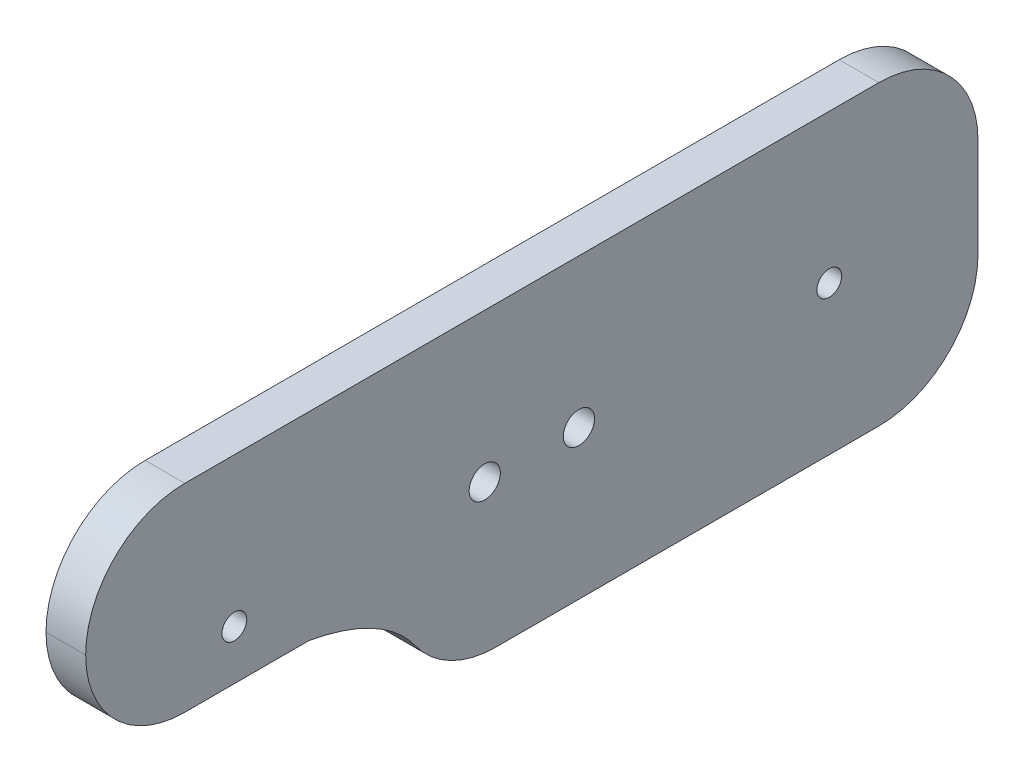
ISO-10303-21;
HEADER;
FILE_DESCRIPTION(('STEP AP214'),'2;1');
FILE_NAME('part.step','',(''),(''),'','','');
FILE_SCHEMA(('AUTOMOTIVE_DESIGN { 1 0 10303 214 1 1 1 1 }'));
ENDSEC;
DATA;
#1=APPLICATION_CONTEXT('core data for automotive mechanical design processes');
#2=APPLICATION_PROTOCOL_DEFINITION('international standard','automotive_design',2000,#1);
#3=PRODUCT_CONTEXT('',#1,'mechanical');
#4=PRODUCT('Part','Part','',(#3));
#5=PRODUCT_RELATED_PRODUCT_CATEGORY('part','',(#4));
#6=PRODUCT_DEFINITION_FORMATION('','',#4);
#7=PRODUCT_DEFINITION_CONTEXT('part definition',#1,'design');
#8=PRODUCT_DEFINITION('design','',#6,#7);
#9=PRODUCT_DEFINITION_SHAPE('','',#8);
#10=(LENGTH_UNIT() NAMED_UNIT(*) SI_UNIT(.MILLI.,.METRE.));
#11=(NAMED_UNIT(*) PLANE_ANGLE_UNIT() SI_UNIT($,.RADIAN.));
#12=(NAMED_UNIT(*) SI_UNIT($,.STERADIAN.) SOLID_ANGLE_UNIT());
#13=UNCERTAINTY_MEASURE_WITH_UNIT(LENGTH_MEASURE(1.E-05),#10,'distance_accuracy_value','');
#14=(GEOMETRIC_REPRESENTATION_CONTEXT(3) GLOBAL_UNCERTAINTY_ASSIGNED_CONTEXT((#13)) GLOBAL_UNIT_ASSIGNED_CONTEXT((#10,
#11,#12)) REPRESENTATION_CONTEXT('',''));
#15=CARTESIAN_POINT('',(0.,0.,0.));
#16=DIRECTION('',(0.,0.,1.));
#17=DIRECTION('',(1.,0.,0.));
#18=AXIS2_PLACEMENT_3D('',#15,#16,#17);
#19=CARTESIAN_POINT('',(4.,-15.,-45.));
#20=DIRECTION('',(0.,0.,1.));
#21=DIRECTION('',(1.,0.,0.));
#22=AXIS2_PLACEMENT_3D('',#19,#20,#21);
#23=PLANE('',#22);
#24=DIRECTION('',(0.,1.,0.));
#25=VECTOR('',#24,1.);
#26=CARTESIAN_POINT('',(4.,-15.,-45.));
#27=LINE('',#26,#25);
#28=CARTESIAN_POINT('',(4.,-5.,-45.));
#29=VERTEX_POINT('',#28);
#30=CARTESIAN_POINT('',(4.,5.,-45.));
#31=VERTEX_POINT('',#30);
#32=EDGE_CURVE('E125',#29,#31,#27,.T.);
#33=ORIENTED_EDGE('',*,*,#32,.F.);
#34=DIRECTION('',(-1.,0.,0.));
#35=VECTOR('',#34,1.);
#36=CARTESIAN_POINT('',(4.,-5.,-45.));
#37=LINE('',#36,#35);
#38=CARTESIAN_POINT('',(0.,-5.,-45.));
#39=VERTEX_POINT('',#38);
#40=EDGE_CURVE('E112',#29,#39,#37,.T.);
#41=ORIENTED_EDGE('',*,*,#40,.T.);
#42=DIRECTION('',(0.,1.,0.));
#43=VECTOR('',#42,1.);
#44=CARTESIAN_POINT('',(0.,-15.,-45.));
#45=LINE('',#44,#43);
#46=CARTESIAN_POINT('',(0.,5.,-45.));
#47=VERTEX_POINT('',#46);
#48=EDGE_CURVE('E122',#39,#47,#45,.T.);
#49=ORIENTED_EDGE('',*,*,#48,.T.);
#50=DIRECTION('',(-1.,0.,0.));
#51=VECTOR('',#50,1.);
#52=CARTESIAN_POINT('',(4.,5.,-45.));
#53=LINE('',#52,#51);
#54=EDGE_CURVE('E127',#47,#31,#53,.F.);
#55=ORIENTED_EDGE('',*,*,#54,.T.);
#56=EDGE_LOOP('',(#33,#41,#49,#55));
#57=FACE_BOUND('',#56,.T.);
#58=ADVANCED_FACE('F32',(#57),#23,.F.);
#59=CARTESIAN_POINT('',(4.,15.,45.));
#60=DIRECTION('',(0.,-1.,0.));
#61=DIRECTION('',(0.,0.,-1.));
#62=AXIS2_PLACEMENT_3D('',#59,#60,#61);
#63=PLANE('',#62);
#64=DIRECTION('',(0.,0.,1.));
#65=VECTOR('',#64,1.);
#66=CARTESIAN_POINT('',(4.,15.,45.));
#67=LINE('',#66,#65);
#68=CARTESIAN_POINT('',(4.,15.,-35.));
#69=VERTEX_POINT('',#68);
#70=CARTESIAN_POINT('',(4.,15.,35.));
#71=VERTEX_POINT('',#70);
#72=EDGE_CURVE('E227',#69,#71,#67,.T.);
#73=ORIENTED_EDGE('',*,*,#72,.F.);
#74=DIRECTION('',(-1.,0.,0.));
#75=VECTOR('',#74,1.);
#76=CARTESIAN_POINT('',(4.,15.,-35.));
#77=LINE('',#76,#75);
#78=CARTESIAN_POINT('',(0.,15.,-35.));
#79=VERTEX_POINT('',#78);
#80=EDGE_CURVE('E159',#69,#79,#77,.T.);
#81=ORIENTED_EDGE('',*,*,#80,.T.);
#82=DIRECTION('',(0.,0.,1.));
#83=VECTOR('',#82,1.);
#84=CARTESIAN_POINT('',(0.,15.,45.));
#85=LINE('',#84,#83);
#86=CARTESIAN_POINT('',(0.,15.,35.));
#87=VERTEX_POINT('',#86);
#88=EDGE_CURVE('E132',#79,#87,#85,.T.);
#89=ORIENTED_EDGE('',*,*,#88,.T.);
#90=DIRECTION('',(-1.,0.,0.));
#91=VECTOR('',#90,1.);
#92=CARTESIAN_POINT('',(4.,15.,35.));
#93=LINE('',#92,#91);
#94=EDGE_CURVE('E157',#87,#71,#93,.F.);
#95=ORIENTED_EDGE('',*,*,#94,.T.);
#96=EDGE_LOOP('',(#73,#81,#89,#95));
#97=FACE_BOUND('',#96,.T.);
#98=ADVANCED_FACE('F239',(#97),#63,.F.);
#99=CARTESIAN_POINT('',(4.,-15.,45.));
#100=DIRECTION('',(0.,1.,0.));
#101=DIRECTION('',(0.,0.,1.));
#102=AXIS2_PLACEMENT_3D('',#99,#100,#101);
#103=PLANE('',#102);
#104=DIRECTION('',(0.,0.,-1.));
#105=VECTOR('',#104,1.);
#106=CARTESIAN_POINT('',(4.,-15.,45.));
#107=LINE('',#106,#105);
#108=CARTESIAN_POINT('',(4.,-15.,3.61306446035863));
#109=VERTEX_POINT('',#108);
#110=CARTESIAN_POINT('',(4.,-15.,-35.));
#111=VERTEX_POINT('',#110);
#112=EDGE_CURVE('E142',#109,#111,#107,.T.);
#113=ORIENTED_EDGE('',*,*,#112,.F.);
#114=DIRECTION('',(-1.,0.,0.));
#115=VECTOR('',#114,1.);
#116=CARTESIAN_POINT('',(0.,-15.,3.61306446035861));
#117=LINE('',#116,#115);
#118=CARTESIAN_POINT('',(0.,-15.,3.61306446035863));
#119=VERTEX_POINT('',#118);
#120=EDGE_CURVE('E40',#109,#119,#117,.T.);
#121=ORIENTED_EDGE('',*,*,#120,.T.);
#122=DIRECTION('',(0.,0.,-1.));
#123=VECTOR('',#122,1.);
#124=CARTESIAN_POINT('',(0.,-15.,45.));
#125=LINE('',#124,#123);
#126=CARTESIAN_POINT('',(0.,-15.,-35.));
#127=VERTEX_POINT('',#126);
#128=EDGE_CURVE('E136',#119,#127,#125,.T.);
#129=ORIENTED_EDGE('',*,*,#128,.T.);
#130=DIRECTION('',(-1.,0.,0.));
#131=VECTOR('',#130,1.);
#132=CARTESIAN_POINT('',(4.,-15.,-35.));
#133=LINE('',#132,#131);
#134=EDGE_CURVE('E114',#127,#111,#133,.F.);
#135=ORIENTED_EDGE('',*,*,#134,.T.);
#136=EDGE_LOOP('',(#113,#121,#129,#135));
#137=FACE_BOUND('',#136,.T.);
#138=ADVANCED_FACE('F231',(#137),#103,.F.);
#139=CARTESIAN_POINT('',(4.,0.,0.));
#140=DIRECTION('',(-1.,0.,0.));
#141=DIRECTION('',(0.,0.,1.));
#142=AXIS2_PLACEMENT_3D('',#139,#140,#141);
#143=PLANE('',#142);
#144=CARTESIAN_POINT('',(4.,-5.,22.5));
#145=CARTESIAN_POINT('',(4.,-6.22849461948267,15.5328607990294));
#146=CARTESIAN_POINT('',(4.,-9.74512800622977,10.9265757126709));
#147=CARTESIAN_POINT('',(4.,-15.,9.99999999999998));
#148=B_SPLINE_CURVE_WITH_KNOTS('',3,(#144,#145,#146,#147),.UNSPECIFIED.,.F.,.F.,(4,4),(0.,1.),.UNSPECIFIED.);
#149=CARTESIAN_POINT('',(4.,-5.,22.5));
#150=VERTEX_POINT('',#149);
#151=CARTESIAN_POINT('',(4.,-10.812230751289,11.7505071602349));
#152=VERTEX_POINT('',#151);
#153=EDGE_CURVE('E182',#150,#152,#148,.T.);
#154=ORIENTED_EDGE('',*,*,#153,.T.);
#155=CARTESIAN_POINT('',(4.,-5.00000000000001,3.61306446035861));
#156=DIRECTION('',(-1.,0.,0.));
#157=DIRECTION('',(0.,0.,1.));
#158=AXIS2_PLACEMENT_3D('',#155,#156,#157);
#159=CIRCLE('',#158,10.);
#160=EDGE_CURVE('E54',#152,#109,#159,.F.);
#161=ORIENTED_EDGE('',*,*,#160,.T.);
#162=ORIENTED_EDGE('',*,*,#112,.T.);
#163=CARTESIAN_POINT('',(4.,-5.,-35.));
#164=DIRECTION('',(-1.,0.,0.));
#165=DIRECTION('',(0.,0.,1.));
#166=AXIS2_PLACEMENT_3D('',#163,#164,#165);
#167=CIRCLE('',#166,10.);
#168=EDGE_CURVE('E155',#111,#29,#167,.F.);
#169=ORIENTED_EDGE('',*,*,#168,.T.);
#170=ORIENTED_EDGE('',*,*,#32,.T.);
#171=CARTESIAN_POINT('',(4.,5.,-35.));
#172=DIRECTION('',(-1.,0.,0.));
#173=DIRECTION('',(0.,0.,1.));
#174=AXIS2_PLACEMENT_3D('',#171,#172,#173);
#175=CIRCLE('',#174,10.);
#176=EDGE_CURVE('E153',#31,#69,#175,.F.);
#177=ORIENTED_EDGE('',*,*,#176,.T.);
#178=ORIENTED_EDGE('',*,*,#72,.T.);
#179=CARTESIAN_POINT('',(4.,5.,35.));
#180=DIRECTION('',(-1.,0.,0.));
#181=DIRECTION('',(0.,0.,1.));
#182=AXIS2_PLACEMENT_3D('',#179,#180,#181);
#183=CIRCLE('',#182,10.);
#184=CARTESIAN_POINT('',(4.,5.,45.));
#185=VERTEX_POINT('',#184);
#186=EDGE_CURVE('E150',#71,#185,#183,.F.);
#187=ORIENTED_EDGE('',*,*,#186,.T.);
#188=CARTESIAN_POINT('',(4.,5.,35.));
#189=DIRECTION('',(-1.,0.,0.));
#190=DIRECTION('',(0.,0.,1.));
#191=AXIS2_PLACEMENT_3D('',#188,#189,#190);
#192=CIRCLE('',#191,10.);
#193=CARTESIAN_POINT('',(4.,-5.,35.));
#194=VERTEX_POINT('',#193);
#195=EDGE_CURVE('E165',#185,#194,#192,.F.);
#196=ORIENTED_EDGE('',*,*,#195,.T.);
#197=DIRECTION('',(0.,0.,1.));
#198=VECTOR('',#197,1.);
#199=CARTESIAN_POINT('',(4.,-5.,45.));
#200=LINE('',#199,#198);
#201=EDGE_CURVE('E190',#150,#194,#200,.T.);
#202=ORIENTED_EDGE('',*,*,#201,.F.);
#203=EDGE_LOOP('',(#154,#161,#162,#169,#170,#177,#178,#187,#196,#202));
#204=FACE_BOUND('',#203,.T.);
#205=CARTESIAN_POINT('',(4.,0.,-30.));
#206=DIRECTION('',(1.,0.,0.));
#207=DIRECTION('',(0.,0.,-1.));
#208=AXIS2_PLACEMENT_3D('',#205,#206,#207);
#209=CIRCLE('',#208,1.25000000000001);
#210=CARTESIAN_POINT('',(4.,0.,-31.25));
#211=VERTEX_POINT('',#210);
#212=EDGE_CURVE('E206',#211,#211,#209,.T.);
#213=ORIENTED_EDGE('',*,*,#212,.F.);
#214=EDGE_LOOP('',(#213));
#215=FACE_BOUND('',#214,.T.);
#216=CARTESIAN_POINT('',(4.,0.,30.));
#217=DIRECTION('',(1.,0.,0.));
#218=DIRECTION('',(0.,0.,-1.));
#219=AXIS2_PLACEMENT_3D('',#216,#217,#218);
#220=CIRCLE('',#219,1.25);
#221=CARTESIAN_POINT('',(4.,0.,28.75));
#222=VERTEX_POINT('',#221);
#223=EDGE_CURVE('E211',#222,#222,#220,.T.);
#224=ORIENTED_EDGE('',*,*,#223,.F.);
#225=EDGE_LOOP('',(#224));
#226=FACE_BOUND('',#225,.T.);
#227=CARTESIAN_POINT('',(4.,0.,-4.75));
#228=DIRECTION('',(1.,0.,0.));
#229=DIRECTION('',(0.,0.,-1.));
#230=AXIS2_PLACEMENT_3D('',#227,#228,#229);
#231=CIRCLE('',#230,1.575);
#232=CARTESIAN_POINT('',(4.,0.,-6.325));
#233=VERTEX_POINT('',#232);
#234=EDGE_CURVE('E217',#233,#233,#231,.T.);
#235=ORIENTED_EDGE('',*,*,#234,.F.);
#236=EDGE_LOOP('',(#235));
#237=FACE_BOUND('',#236,.T.);
#238=CARTESIAN_POINT('',(4.,0.,4.75));
#239=DIRECTION('',(1.,0.,0.));
#240=DIRECTION('',(0.,0.,-1.));
#241=AXIS2_PLACEMENT_3D('',#238,#239,#240);
#242=CIRCLE('',#241,1.575);
#243=CARTESIAN_POINT('',(4.,0.,3.175));
#244=VERTEX_POINT('',#243);
#245=EDGE_CURVE('E139',#244,#244,#242,.T.);
#246=ORIENTED_EDGE('',*,*,#245,.F.);
#247=EDGE_LOOP('',(#246));
#248=FACE_BOUND('',#247,.T.);
#249=ADVANCED_FACE('F188',(#204,#215,#226,#237,#248),#143,.F.);
#250=CARTESIAN_POINT('',(0.,0.,0.));
#251=DIRECTION('',(-1.,0.,0.));
#252=DIRECTION('',(0.,0.,1.));
#253=AXIS2_PLACEMENT_3D('',#250,#251,#252);
#254=PLANE('',#253);
#255=ORIENTED_EDGE('',*,*,#128,.F.);
#256=CARTESIAN_POINT('',(0.,-5.00000000000001,3.61306446035861));
#257=DIRECTION('',(-1.,0.,0.));
#258=DIRECTION('',(0.,0.,1.));
#259=AXIS2_PLACEMENT_3D('',#256,#257,#258);
#260=CIRCLE('',#259,10.);
#261=CARTESIAN_POINT('',(0.,-10.812230751289,11.7505071602349));
#262=VERTEX_POINT('',#261);
#263=EDGE_CURVE('E11',#119,#262,#260,.T.);
#264=ORIENTED_EDGE('',*,*,#263,.T.);
#265=CARTESIAN_POINT('',(0.,-5.,22.5));
#266=CARTESIAN_POINT('',(0.,-6.22849461948267,15.5328607990294));
#267=CARTESIAN_POINT('',(0.,-9.74512800622977,10.9265757126709));
#268=CARTESIAN_POINT('',(0.,-15.,9.99999999999998));
#269=B_SPLINE_CURVE_WITH_KNOTS('',3,(#265,#266,#267,#268),.UNSPECIFIED.,.F.,.F.,(4,4),(0.,1.),.UNSPECIFIED.);
#270=CARTESIAN_POINT('',(0.,-5.,22.5));
#271=VERTEX_POINT('',#270);
#272=EDGE_CURVE('E184',#271,#262,#269,.T.);
#273=ORIENTED_EDGE('',*,*,#272,.F.);
#274=DIRECTION('',(0.,0.,1.));
#275=VECTOR('',#274,1.);
#276=CARTESIAN_POINT('',(0.,-5.,45.));
#277=LINE('',#276,#275);
#278=CARTESIAN_POINT('',(0.,-5.,35.));
#279=VERTEX_POINT('',#278);
#280=EDGE_CURVE('E204',#271,#279,#277,.T.);
#281=ORIENTED_EDGE('',*,*,#280,.T.);
#282=CARTESIAN_POINT('',(0.,5.,35.));
#283=DIRECTION('',(-1.,0.,0.));
#284=DIRECTION('',(0.,0.,1.));
#285=AXIS2_PLACEMENT_3D('',#282,#283,#284);
#286=CIRCLE('',#285,10.);
#287=CARTESIAN_POINT('',(0.,5.,45.));
#288=VERTEX_POINT('',#287);
#289=EDGE_CURVE('E171',#279,#288,#286,.T.);
#290=ORIENTED_EDGE('',*,*,#289,.T.);
#291=CARTESIAN_POINT('',(0.,5.,35.));
#292=DIRECTION('',(-1.,0.,0.));
#293=DIRECTION('',(0.,0.,1.));
#294=AXIS2_PLACEMENT_3D('',#291,#292,#293);
#295=CIRCLE('',#294,10.);
#296=EDGE_CURVE('E126',#288,#87,#295,.T.);
#297=ORIENTED_EDGE('',*,*,#296,.T.);
#298=ORIENTED_EDGE('',*,*,#88,.F.);
#299=CARTESIAN_POINT('',(0.,5.,-35.));
#300=DIRECTION('',(-1.,0.,0.));
#301=DIRECTION('',(0.,0.,1.));
#302=AXIS2_PLACEMENT_3D('',#299,#300,#301);
#303=CIRCLE('',#302,10.);
#304=EDGE_CURVE('E117',#79,#47,#303,.T.);
#305=ORIENTED_EDGE('',*,*,#304,.T.);
#306=ORIENTED_EDGE('',*,*,#48,.F.);
#307=CARTESIAN_POINT('',(0.,-5.,-35.));
#308=DIRECTION('',(-1.,0.,0.));
#309=DIRECTION('',(0.,0.,1.));
#310=AXIS2_PLACEMENT_3D('',#307,#308,#309);
#311=CIRCLE('',#310,10.);
#312=EDGE_CURVE('E108',#39,#127,#311,.T.);
#313=ORIENTED_EDGE('',*,*,#312,.T.);
#314=EDGE_LOOP('',(#255,#264,#273,#281,#290,#297,#298,#305,#306,#313));
#315=FACE_BOUND('',#314,.T.);
#316=CARTESIAN_POINT('',(0.,0.,-30.));
#317=DIRECTION('',(1.,0.,0.));
#318=DIRECTION('',(0.,0.,-1.));
#319=AXIS2_PLACEMENT_3D('',#316,#317,#318);
#320=CIRCLE('',#319,1.25000000000001);
#321=CARTESIAN_POINT('',(0.,0.,-31.25));
#322=VERTEX_POINT('',#321);
#323=EDGE_CURVE('E208',#322,#322,#320,.T.);
#324=ORIENTED_EDGE('',*,*,#323,.T.);
#325=EDGE_LOOP('',(#324));
#326=FACE_BOUND('',#325,.T.);
#327=CARTESIAN_POINT('',(0.,0.,30.));
#328=DIRECTION('',(1.,0.,0.));
#329=DIRECTION('',(0.,0.,-1.));
#330=AXIS2_PLACEMENT_3D('',#327,#328,#329);
#331=CIRCLE('',#330,1.25);
#332=CARTESIAN_POINT('',(0.,0.,28.75));
#333=VERTEX_POINT('',#332);
#334=EDGE_CURVE('E214',#333,#333,#331,.T.);
#335=ORIENTED_EDGE('',*,*,#334,.T.);
#336=EDGE_LOOP('',(#335));
#337=FACE_BOUND('',#336,.T.);
#338=CARTESIAN_POINT('',(0.,0.,-4.75));
#339=DIRECTION('',(1.,0.,0.));
#340=DIRECTION('',(0.,0.,-1.));
#341=AXIS2_PLACEMENT_3D('',#338,#339,#340);
#342=CIRCLE('',#341,1.575);
#343=CARTESIAN_POINT('',(0.,0.,-6.325));
#344=VERTEX_POINT('',#343);
#345=EDGE_CURVE('E220',#344,#344,#342,.T.);
#346=ORIENTED_EDGE('',*,*,#345,.T.);
#347=EDGE_LOOP('',(#346));
#348=FACE_BOUND('',#347,.T.);
#349=CARTESIAN_POINT('',(0.,0.,4.75));
#350=DIRECTION('',(1.,0.,0.));
#351=DIRECTION('',(0.,0.,-1.));
#352=AXIS2_PLACEMENT_3D('',#349,#350,#351);
#353=CIRCLE('',#352,1.575);
#354=CARTESIAN_POINT('',(0.,0.,3.175));
#355=VERTEX_POINT('',#354);
#356=EDGE_CURVE('E133',#355,#355,#353,.T.);
#357=ORIENTED_EDGE('',*,*,#356,.T.);
#358=EDGE_LOOP('',(#357));
#359=FACE_BOUND('',#358,.T.);
#360=ADVANCED_FACE('F129',(#315,#326,#337,#348,#359),#254,.T.);
#361=CARTESIAN_POINT('',(0.,0.,4.75));
#362=DIRECTION('',(1.,0.,0.));
#363=DIRECTION('',(0.,0.,-1.));
#364=AXIS2_PLACEMENT_3D('',#361,#362,#363);
#365=CYLINDRICAL_SURFACE('',#364,1.575);
#366=ORIENTED_EDGE('',*,*,#356,.F.);
#367=EDGE_LOOP('',(#366));
#368=FACE_BOUND('',#367,.T.);
#369=ORIENTED_EDGE('',*,*,#245,.T.);
#370=EDGE_LOOP('',(#369));
#371=FACE_BOUND('',#370,.T.);
#372=ADVANCED_FACE('F286',(#368,#371),#365,.F.);
#373=CARTESIAN_POINT('',(0.,0.,-4.75));
#374=DIRECTION('',(1.,0.,0.));
#375=DIRECTION('',(0.,0.,-1.));
#376=AXIS2_PLACEMENT_3D('',#373,#374,#375);
#377=CYLINDRICAL_SURFACE('',#376,1.575);
#378=ORIENTED_EDGE('',*,*,#345,.F.);
#379=EDGE_LOOP('',(#378));
#380=FACE_BOUND('',#379,.T.);
#381=ORIENTED_EDGE('',*,*,#234,.T.);
#382=EDGE_LOOP('',(#381));
#383=FACE_BOUND('',#382,.T.);
#384=ADVANCED_FACE('F282',(#380,#383),#377,.F.);
#385=CARTESIAN_POINT('',(0.,0.,30.));
#386=DIRECTION('',(1.,0.,0.));
#387=DIRECTION('',(0.,0.,-1.));
#388=AXIS2_PLACEMENT_3D('',#385,#386,#387);
#389=CYLINDRICAL_SURFACE('',#388,1.25);
#390=ORIENTED_EDGE('',*,*,#334,.F.);
#391=EDGE_LOOP('',(#390));
#392=FACE_BOUND('',#391,.T.);
#393=ORIENTED_EDGE('',*,*,#223,.T.);
#394=EDGE_LOOP('',(#393));
#395=FACE_BOUND('',#394,.T.);
#396=ADVANCED_FACE('F276',(#392,#395),#389,.F.);
#397=CARTESIAN_POINT('',(0.,0.,-30.));
#398=DIRECTION('',(1.,0.,0.));
#399=DIRECTION('',(0.,0.,-1.));
#400=AXIS2_PLACEMENT_3D('',#397,#398,#399);
#401=CYLINDRICAL_SURFACE('',#400,1.25000000000001);
#402=ORIENTED_EDGE('',*,*,#323,.F.);
#403=EDGE_LOOP('',(#402));
#404=FACE_BOUND('',#403,.T.);
#405=ORIENTED_EDGE('',*,*,#212,.T.);
#406=EDGE_LOOP('',(#405));
#407=FACE_BOUND('',#406,.T.);
#408=ADVANCED_FACE('F271',(#404,#407),#401,.F.);
#409=CARTESIAN_POINT('',(0.,-5.,45.));
#410=DIRECTION('',(0.,1.,0.));
#411=DIRECTION('',(0.,0.,1.));
#412=AXIS2_PLACEMENT_3D('',#409,#410,#411);
#413=PLANE('',#412);
#414=ORIENTED_EDGE('',*,*,#280,.F.);
#415=DIRECTION('',(1.,0.,0.));
#416=VECTOR('',#415,1.);
#417=CARTESIAN_POINT('',(0.,-5.,22.5));
#418=LINE('',#417,#416);
#419=EDGE_CURVE('E192',#271,#150,#418,.T.);
#420=ORIENTED_EDGE('',*,*,#419,.T.);
#421=ORIENTED_EDGE('',*,*,#201,.T.);
#422=DIRECTION('',(1.,0.,0.));
#423=VECTOR('',#422,1.);
#424=CARTESIAN_POINT('',(0.,-5.,35.));
#425=LINE('',#424,#423);
#426=EDGE_CURVE('E168',#194,#279,#425,.F.);
#427=ORIENTED_EDGE('',*,*,#426,.T.);
#428=EDGE_LOOP('',(#414,#420,#421,#427));
#429=FACE_BOUND('',#428,.T.);
#430=ADVANCED_FACE('F251',(#429),#413,.F.);
#431=CARTESIAN_POINT('',(4.,-5.,-35.));
#432=DIRECTION('',(-1.,0.,0.));
#433=DIRECTION('',(0.,0.,1.));
#434=AXIS2_PLACEMENT_3D('',#431,#432,#433);
#435=CYLINDRICAL_SURFACE('',#434,10.);
#436=ORIENTED_EDGE('',*,*,#168,.F.);
#437=ORIENTED_EDGE('',*,*,#134,.F.);
#438=ORIENTED_EDGE('',*,*,#312,.F.);
#439=ORIENTED_EDGE('',*,*,#40,.F.);
#440=EDGE_LOOP('',(#436,#437,#438,#439));
#441=FACE_BOUND('',#440,.T.);
#442=ADVANCED_FACE('F111',(#441),#435,.T.);
#443=CARTESIAN_POINT('',(4.,5.,-35.));
#444=DIRECTION('',(-1.,0.,0.));
#445=DIRECTION('',(0.,0.,1.));
#446=AXIS2_PLACEMENT_3D('',#443,#444,#445);
#447=CYLINDRICAL_SURFACE('',#446,10.);
#448=ORIENTED_EDGE('',*,*,#176,.F.);
#449=ORIENTED_EDGE('',*,*,#54,.F.);
#450=ORIENTED_EDGE('',*,*,#304,.F.);
#451=ORIENTED_EDGE('',*,*,#80,.F.);
#452=EDGE_LOOP('',(#448,#449,#450,#451));
#453=FACE_BOUND('',#452,.T.);
#454=ADVANCED_FACE('F250',(#453),#447,.T.);
#455=CARTESIAN_POINT('',(4.,5.,35.));
#456=DIRECTION('',(-1.,0.,0.));
#457=DIRECTION('',(0.,0.,1.));
#458=AXIS2_PLACEMENT_3D('',#455,#456,#457);
#459=CYLINDRICAL_SURFACE('',#458,10.);
#460=ORIENTED_EDGE('',*,*,#186,.F.);
#461=ORIENTED_EDGE('',*,*,#94,.F.);
#462=ORIENTED_EDGE('',*,*,#296,.F.);
#463=DIRECTION('',(-1.,0.,0.));
#464=VECTOR('',#463,1.);
#465=CARTESIAN_POINT('',(4.,5.,45.));
#466=LINE('',#465,#464);
#467=EDGE_CURVE('E162',#185,#288,#466,.T.);
#468=ORIENTED_EDGE('',*,*,#467,.F.);
#469=EDGE_LOOP('',(#460,#461,#462,#468));
#470=FACE_BOUND('',#469,.T.);
#471=ADVANCED_FACE('F254',(#470),#459,.T.);
#472=CARTESIAN_POINT('',(4.,5.,35.));
#473=DIRECTION('',(1.,0.,0.));
#474=DIRECTION('',(0.,0.,-1.));
#475=AXIS2_PLACEMENT_3D('',#472,#473,#474);
#476=CYLINDRICAL_SURFACE('',#475,10.);
#477=ORIENTED_EDGE('',*,*,#289,.F.);
#478=ORIENTED_EDGE('',*,*,#426,.F.);
#479=ORIENTED_EDGE('',*,*,#195,.F.);
#480=ORIENTED_EDGE('',*,*,#467,.T.);
#481=EDGE_LOOP('',(#477,#478,#479,#480));
#482=FACE_BOUND('',#481,.T.);
#483=ADVANCED_FACE('F236',(#482),#476,.T.);
#484=DIRECTION('',(1.,0.,0.));
#485=VECTOR('',#484,1.);
#486=SURFACE_OF_LINEAR_EXTRUSION('',#269,#485);
#487=ORIENTED_EDGE('',*,*,#272,.T.);
#488=DIRECTION('',(1.,0.,0.));
#489=VECTOR('',#488,1.);
#490=CARTESIAN_POINT('',(0.,-10.812230751289,11.7505071602349));
#491=LINE('',#490,#489);
#492=EDGE_CURVE('E173',#262,#152,#491,.T.);
#493=ORIENTED_EDGE('',*,*,#492,.T.);
#494=ORIENTED_EDGE('',*,*,#153,.F.);
#495=ORIENTED_EDGE('',*,*,#419,.F.);
#496=EDGE_LOOP('',(#487,#493,#494,#495));
#497=FACE_BOUND('',#496,.T.);
#498=ADVANCED_FACE('F180',(#497),#486,.T.);
#499=CARTESIAN_POINT('',(2.,-5.00000000000001,3.61306446035861));
#500=DIRECTION('',(1.,0.,0.));
#501=DIRECTION('',(0.,0.,-1.));
#502=AXIS2_PLACEMENT_3D('',#499,#500,#501);
#503=CYLINDRICAL_SURFACE('',#502,10.);
#504=ORIENTED_EDGE('',*,*,#263,.F.);
#505=ORIENTED_EDGE('',*,*,#120,.F.);
#506=ORIENTED_EDGE('',*,*,#160,.F.);
#507=ORIENTED_EDGE('',*,*,#492,.F.);
#508=EDGE_LOOP('',(#504,#505,#506,#507));
#509=FACE_BOUND('',#508,.T.);
#510=ADVANCED_FACE('F34',(#509),#503,.T.);
#511=CLOSED_SHELL('',(#58,#98,#138,#249,#360,#372,#384,#396,#408,#430,#442,#454,#471,#483,#498,#510));
#512=MANIFOLD_SOLID_BREP('B2',#511);
#513=ADVANCED_BREP_SHAPE_REPRESENTATION('',(#18,#512),#14);
#514=SHAPE_DEFINITION_REPRESENTATION(#9,#513);
ENDSEC;
END-ISO-10303-21;
